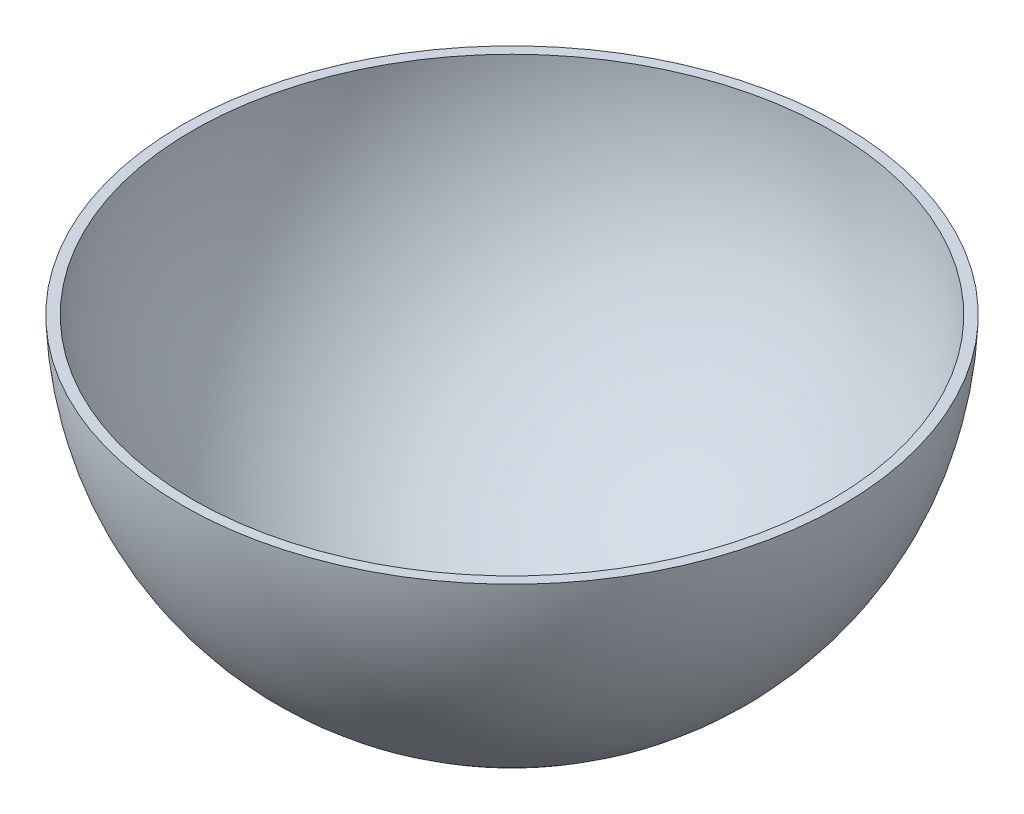
ISO-10303-21;
HEADER;
FILE_DESCRIPTION(('STEP AP214'),'2;1');
FILE_NAME('part.step','',(''),(''),'','','');
FILE_SCHEMA(('AUTOMOTIVE_DESIGN { 1 0 10303 214 1 1 1 1 }'));
ENDSEC;
DATA;
#1=APPLICATION_CONTEXT('core data for automotive mechanical design processes');
#2=APPLICATION_PROTOCOL_DEFINITION('international standard','automotive_design',2000,#1);
#3=PRODUCT_CONTEXT('',#1,'mechanical');
#4=PRODUCT('Part','Part','',(#3));
#5=PRODUCT_RELATED_PRODUCT_CATEGORY('part','',(#4));
#6=PRODUCT_DEFINITION_FORMATION('','',#4);
#7=PRODUCT_DEFINITION_CONTEXT('part definition',#1,'design');
#8=PRODUCT_DEFINITION('design','',#6,#7);
#9=PRODUCT_DEFINITION_SHAPE('','',#8);
#10=(LENGTH_UNIT() NAMED_UNIT(*) SI_UNIT(.MILLI.,.METRE.));
#11=(NAMED_UNIT(*) PLANE_ANGLE_UNIT() SI_UNIT($,.RADIAN.));
#12=(NAMED_UNIT(*) SI_UNIT($,.STERADIAN.) SOLID_ANGLE_UNIT());
#13=UNCERTAINTY_MEASURE_WITH_UNIT(LENGTH_MEASURE(1.E-05),#10,'distance_accuracy_value','');
#14=(GEOMETRIC_REPRESENTATION_CONTEXT(3) GLOBAL_UNCERTAINTY_ASSIGNED_CONTEXT((#13)) GLOBAL_UNIT_ASSIGNED_CONTEXT((#10,
#11,#12)) REPRESENTATION_CONTEXT('',''));
#15=CARTESIAN_POINT('',(0.,0.,0.));
#16=DIRECTION('',(0.,0.,1.));
#17=DIRECTION('',(1.,0.,0.));
#18=AXIS2_PLACEMENT_3D('',#15,#16,#17);
#19=CARTESIAN_POINT('',(0.,0.,0.));
#20=DIRECTION('',(0.,1.,0.));
#21=DIRECTION('',(0.,0.,1.));
#22=AXIS2_PLACEMENT_3D('',#19,#20,#21);
#23=PLANE('',#22);
#24=CARTESIAN_POINT('',(0.,0.,0.));
#25=DIRECTION('',(0.,1.,0.));
#26=DIRECTION('',(0.,0.,1.));
#27=AXIS2_PLACEMENT_3D('',#24,#25,#26);
#28=CIRCLE('',#27,249.994794729702);
#29=CARTESIAN_POINT('',(0.,0.,249.994794729702));
#30=VERTEX_POINT('',#29);
#31=EDGE_CURVE('E44',#30,#30,#28,.F.);
#32=ORIENTED_EDGE('',*,*,#31,.T.);
#33=EDGE_LOOP('',(#32));
#34=FACE_BOUND('',#33,.T.);
#35=CARTESIAN_POINT('',(0.,0.,0.));
#36=DIRECTION('',(0.,-1.,0.));
#37=DIRECTION('',(0.,0.,-1.));
#38=AXIS2_PLACEMENT_3D('',#35,#36,#37);
#39=CIRCLE('',#38,258.);
#40=CARTESIAN_POINT('',(0.,0.,-258.));
#41=VERTEX_POINT('',#40);
#42=EDGE_CURVE('E10',#41,#41,#39,.T.);
#43=ORIENTED_EDGE('',*,*,#42,.F.);
#44=EDGE_LOOP('',(#43));
#45=FACE_BOUND('',#44,.T.);
#46=ADVANCED_FACE('F39',(#34,#45),#23,.T.);
#47=CARTESIAN_POINT('',(0.,9.163,0.));
#48=DIRECTION('',(0.,-1.,0.));
#49=DIRECTION('',(1.,0.,0.));
#50=AXIS2_PLACEMENT_3D('',#47,#48,#49);
#51=SPHERICAL_SURFACE('',#50,258.162663003386);
#52=ORIENTED_EDGE('',*,*,#42,.T.);
#53=EDGE_LOOP('',(#52));
#54=FACE_BOUND('',#53,.T.);
#55=ADVANCED_FACE('F54',(#54),#51,.T.);
#56=CARTESIAN_POINT('',(0.,9.163,0.));
#57=DIRECTION('',(0.,-1.,0.));
#58=DIRECTION('',(1.,0.,0.));
#59=AXIS2_PLACEMENT_3D('',#56,#57,#58);
#60=SPHERICAL_SURFACE('',#59,250.162663003386);
#61=ORIENTED_EDGE('',*,*,#31,.F.);
#62=EDGE_LOOP('',(#61));
#63=FACE_BOUND('',#62,.T.);
#64=ADVANCED_FACE('F52',(#63),#60,.F.);
#65=CLOSED_SHELL('',(#46,#55,#64));
#66=MANIFOLD_SOLID_BREP('B2',#65);
#67=ADVANCED_BREP_SHAPE_REPRESENTATION('',(#18,#66),#14);
#68=SHAPE_DEFINITION_REPRESENTATION(#9,#67);
ENDSEC;
END-ISO-10303-21;
